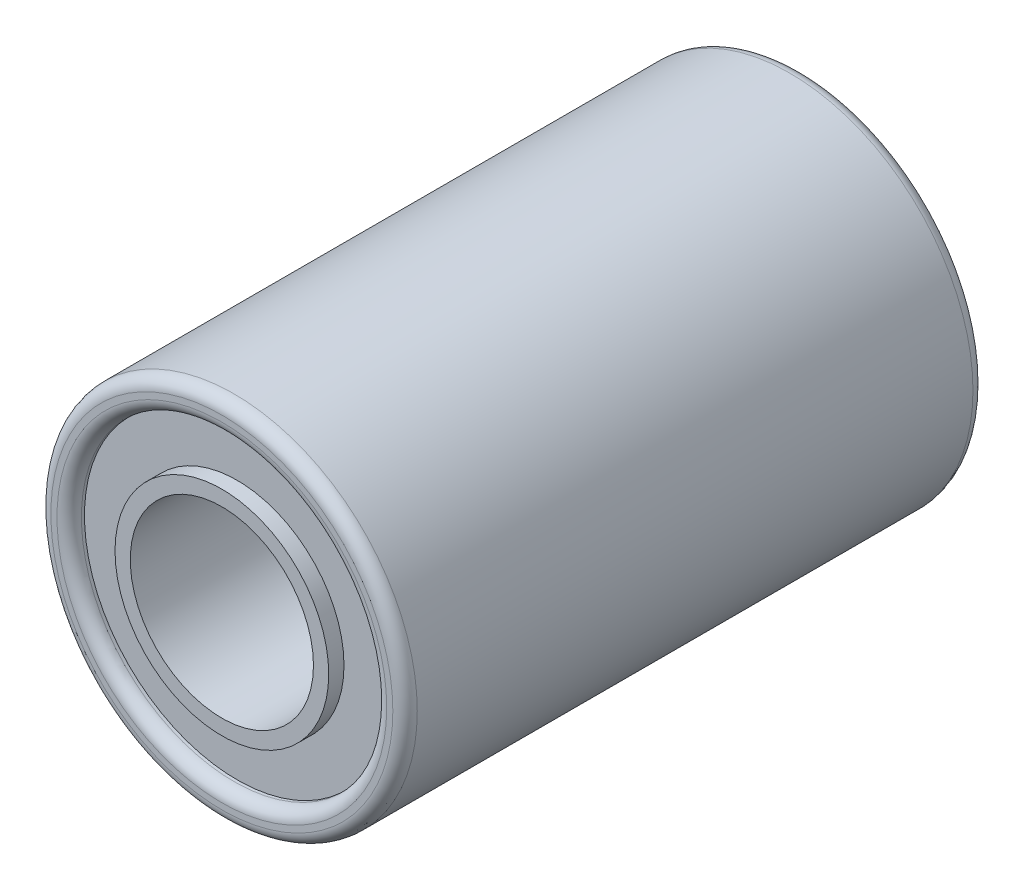
ISO-10303-21;
HEADER;
FILE_DESCRIPTION(('STEP AP214'),'2;1');
FILE_NAME('part.step','',(''),(''),'','','');
FILE_SCHEMA(('AUTOMOTIVE_DESIGN { 1 0 10303 214 1 1 1 1 }'));
ENDSEC;
DATA;
#1=APPLICATION_CONTEXT('core data for automotive mechanical design processes');
#2=APPLICATION_PROTOCOL_DEFINITION('international standard','automotive_design',2000,#1);
#3=PRODUCT_CONTEXT('',#1,'mechanical');
#4=PRODUCT('Part','Part','',(#3));
#5=PRODUCT_RELATED_PRODUCT_CATEGORY('part','',(#4));
#6=PRODUCT_DEFINITION_FORMATION('','',#4);
#7=PRODUCT_DEFINITION_CONTEXT('part definition',#1,'design');
#8=PRODUCT_DEFINITION('design','',#6,#7);
#9=PRODUCT_DEFINITION_SHAPE('','',#8);
#10=(LENGTH_UNIT() NAMED_UNIT(*) SI_UNIT(.MILLI.,.METRE.));
#11=(NAMED_UNIT(*) PLANE_ANGLE_UNIT() SI_UNIT($,.RADIAN.));
#12=(NAMED_UNIT(*) SI_UNIT($,.STERADIAN.) SOLID_ANGLE_UNIT());
#13=UNCERTAINTY_MEASURE_WITH_UNIT(LENGTH_MEASURE(1.E-05),#10,'distance_accuracy_value','');
#14=(GEOMETRIC_REPRESENTATION_CONTEXT(3) GLOBAL_UNCERTAINTY_ASSIGNED_CONTEXT((#13)) GLOBAL_UNIT_ASSIGNED_CONTEXT((#10,
#11,#12)) REPRESENTATION_CONTEXT('',''));
#15=CARTESIAN_POINT('',(0.,0.,0.));
#16=DIRECTION('',(0.,0.,1.));
#17=DIRECTION('',(1.,0.,0.));
#18=AXIS2_PLACEMENT_3D('',#15,#16,#17);
#19=CARTESIAN_POINT('',(0.,0.,0.));
#20=DIRECTION('',(0.,0.,1.));
#21=DIRECTION('',(1.,0.,0.));
#22=AXIS2_PLACEMENT_3D('',#19,#20,#21);
#23=PLANE('',#22);
#24=CARTESIAN_POINT('',(0.,0.,0.));
#25=DIRECTION('',(0.,0.,1.));
#26=DIRECTION('',(1.,0.,0.));
#27=AXIS2_PLACEMENT_3D('',#24,#25,#26);
#28=CIRCLE('',#27,3.);
#29=CARTESIAN_POINT('',(3.,0.,0.));
#30=VERTEX_POINT('',#29);
#31=EDGE_CURVE('E69',#30,#30,#28,.T.);
#32=ORIENTED_EDGE('',*,*,#31,.T.);
#33=EDGE_LOOP('',(#32));
#34=FACE_BOUND('',#33,.T.);
#35=CARTESIAN_POINT('',(0.,0.,0.));
#36=DIRECTION('',(0.,0.,-1.));
#37=DIRECTION('',(-1.,0.,0.));
#38=AXIS2_PLACEMENT_3D('',#35,#36,#37);
#39=CIRCLE('',#38,3.5);
#40=CARTESIAN_POINT('',(-3.5,0.,0.));
#41=VERTEX_POINT('',#40);
#42=EDGE_CURVE('E87',#41,#41,#39,.T.);
#43=ORIENTED_EDGE('',*,*,#42,.T.);
#44=EDGE_LOOP('',(#43));
#45=FACE_BOUND('',#44,.T.);
#46=ADVANCED_FACE('F36',(#34,#45),#23,.F.);
#47=CARTESIAN_POINT('',(0.,0.,19.));
#48=DIRECTION('',(0.,0.,1.));
#49=DIRECTION('',(1.,0.,0.));
#50=AXIS2_PLACEMENT_3D('',#47,#48,#49);
#51=PLANE('',#50);
#52=CARTESIAN_POINT('',(0.,0.,19.));
#53=DIRECTION('',(0.,0.,1.));
#54=DIRECTION('',(1.,0.,0.));
#55=AXIS2_PLACEMENT_3D('',#52,#53,#54);
#56=CIRCLE('',#55,3.);
#57=CARTESIAN_POINT('',(3.,0.,19.));
#58=VERTEX_POINT('',#57);
#59=EDGE_CURVE('E68',#58,#58,#56,.T.);
#60=ORIENTED_EDGE('',*,*,#59,.F.);
#61=EDGE_LOOP('',(#60));
#62=FACE_BOUND('',#61,.T.);
#63=CARTESIAN_POINT('',(0.,0.,19.));
#64=DIRECTION('',(0.,0.,1.));
#65=DIRECTION('',(1.,0.,0.));
#66=AXIS2_PLACEMENT_3D('',#63,#64,#65);
#67=CIRCLE('',#66,3.5);
#68=CARTESIAN_POINT('',(3.5,0.,19.));
#69=VERTEX_POINT('',#68);
#70=EDGE_CURVE('E78',#69,#69,#67,.T.);
#71=ORIENTED_EDGE('',*,*,#70,.T.);
#72=EDGE_LOOP('',(#71));
#73=FACE_BOUND('',#72,.T.);
#74=ADVANCED_FACE('F114',(#62,#73),#51,.T.);
#75=CARTESIAN_POINT('',(0.,0.,19.));
#76=DIRECTION('',(0.,0.,1.));
#77=DIRECTION('',(1.,0.,0.));
#78=AXIS2_PLACEMENT_3D('',#75,#76,#77);
#79=CIRCLE('',#78,5.4);
#80=CARTESIAN_POINT('',(5.4,0.,19.));
#81=VERTEX_POINT('',#80);
#82=EDGE_CURVE('E10',#81,#81,#79,.F.);
#83=ORIENTED_EDGE('',*,*,#82,.T.);
#84=EDGE_LOOP('',(#83));
#85=FACE_BOUND('',#84,.T.);
#86=CARTESIAN_POINT('',(0.,0.,19.));
#87=DIRECTION('',(0.,0.,1.));
#88=DIRECTION('',(1.,0.,0.));
#89=AXIS2_PLACEMENT_3D('',#86,#87,#88);
#90=CIRCLE('',#89,5.6);
#91=CARTESIAN_POINT('',(5.6,0.,19.));
#92=VERTEX_POINT('',#91);
#93=EDGE_CURVE('E43',#92,#92,#90,.T.);
#94=ORIENTED_EDGE('',*,*,#93,.T.);
#95=EDGE_LOOP('',(#94));
#96=FACE_BOUND('',#95,.T.);
#97=ADVANCED_FACE('F121',(#85,#96),#51,.T.);
#98=CARTESIAN_POINT('',(0.,0.,0.));
#99=DIRECTION('',(0.,0.,1.));
#100=DIRECTION('',(1.,0.,0.));
#101=AXIS2_PLACEMENT_3D('',#98,#99,#100);
#102=CIRCLE('',#101,5.4);
#103=CARTESIAN_POINT('',(5.4,0.,0.));
#104=VERTEX_POINT('',#103);
#105=EDGE_CURVE('E59',#104,#104,#102,.T.);
#106=ORIENTED_EDGE('',*,*,#105,.T.);
#107=EDGE_LOOP('',(#106));
#108=FACE_BOUND('',#107,.T.);
#109=CARTESIAN_POINT('',(0.,0.,0.));
#110=DIRECTION('',(0.,0.,1.));
#111=DIRECTION('',(1.,0.,0.));
#112=AXIS2_PLACEMENT_3D('',#109,#110,#111);
#113=CIRCLE('',#112,5.6);
#114=CARTESIAN_POINT('',(5.6,0.,0.));
#115=VERTEX_POINT('',#114);
#116=EDGE_CURVE('E62',#115,#115,#113,.F.);
#117=ORIENTED_EDGE('',*,*,#116,.T.);
#118=EDGE_LOOP('',(#117));
#119=FACE_BOUND('',#118,.T.);
#120=ADVANCED_FACE('F117',(#108,#119),#23,.F.);
#121=CARTESIAN_POINT('',(0.,0.,19.));
#122=DIRECTION('',(0.,0.,-1.));
#123=DIRECTION('',(-1.,0.,0.));
#124=AXIS2_PLACEMENT_3D('',#121,#122,#123);
#125=CYLINDRICAL_SURFACE('',#124,6.);
#126=CARTESIAN_POINT('',(0.,0.,0.400000000000001));
#127=DIRECTION('',(0.,0.,1.));
#128=DIRECTION('',(1.,0.,0.));
#129=AXIS2_PLACEMENT_3D('',#126,#127,#128);
#130=CIRCLE('',#129,6.);
#131=CARTESIAN_POINT('',(6.,0.,0.400000000000001));
#132=VERTEX_POINT('',#131);
#133=EDGE_CURVE('E51',#132,#132,#130,.T.);
#134=ORIENTED_EDGE('',*,*,#133,.T.);
#135=EDGE_LOOP('',(#134));
#136=FACE_BOUND('',#135,.T.);
#137=CARTESIAN_POINT('',(0.,0.,18.6));
#138=DIRECTION('',(0.,0.,1.));
#139=DIRECTION('',(1.,0.,0.));
#140=AXIS2_PLACEMENT_3D('',#137,#138,#139);
#141=CIRCLE('',#140,6.);
#142=CARTESIAN_POINT('',(6.,0.,18.6));
#143=VERTEX_POINT('',#142);
#144=EDGE_CURVE('E56',#143,#143,#141,.F.);
#145=ORIENTED_EDGE('',*,*,#144,.T.);
#146=EDGE_LOOP('',(#145));
#147=FACE_BOUND('',#146,.T.);
#148=ADVANCED_FACE('F127',(#136,#147),#125,.T.);
#149=CARTESIAN_POINT('',(0.,0.,19.));
#150=DIRECTION('',(0.,0.,-1.));
#151=DIRECTION('',(-1.,0.,0.));
#152=AXIS2_PLACEMENT_3D('',#149,#150,#151);
#153=CYLINDRICAL_SURFACE('',#152,3.);
#154=ORIENTED_EDGE('',*,*,#59,.T.);
#155=EDGE_LOOP('',(#154));
#156=FACE_BOUND('',#155,.T.);
#157=ORIENTED_EDGE('',*,*,#31,.F.);
#158=EDGE_LOOP('',(#157));
#159=FACE_BOUND('',#158,.T.);
#160=ADVANCED_FACE('F133',(#156,#159),#153,.F.);
#161=CARTESIAN_POINT('',(0.,0.,18.5));
#162=DIRECTION('',(0.,0.,1.));
#163=DIRECTION('',(1.,0.,0.));
#164=AXIS2_PLACEMENT_3D('',#161,#162,#163);
#165=CYLINDRICAL_SURFACE('',#164,5.);
#166=CARTESIAN_POINT('',(0.,0.,18.6));
#167=DIRECTION('',(0.,0.,1.));
#168=DIRECTION('',(1.,0.,0.));
#169=AXIS2_PLACEMENT_3D('',#166,#167,#168);
#170=CIRCLE('',#169,5.);
#171=CARTESIAN_POINT('',(5.,0.,18.6));
#172=VERTEX_POINT('',#171);
#173=EDGE_CURVE('E47',#172,#172,#170,.T.);
#174=ORIENTED_EDGE('',*,*,#173,.T.);
#175=EDGE_LOOP('',(#174));
#176=FACE_BOUND('',#175,.T.);
#177=CARTESIAN_POINT('',(0.,0.,18.5));
#178=DIRECTION('',(0.,0.,1.));
#179=DIRECTION('',(1.,0.,0.));
#180=AXIS2_PLACEMENT_3D('',#177,#178,#179);
#181=CIRCLE('',#180,5.);
#182=CARTESIAN_POINT('',(5.,0.,18.5));
#183=VERTEX_POINT('',#182);
#184=EDGE_CURVE('E72',#183,#183,#181,.T.);
#185=ORIENTED_EDGE('',*,*,#184,.F.);
#186=EDGE_LOOP('',(#185));
#187=FACE_BOUND('',#186,.T.);
#188=ADVANCED_FACE('F182',(#176,#187),#165,.F.);
#189=CARTESIAN_POINT('',(0.,0.,18.5));
#190=DIRECTION('',(0.,0.,1.));
#191=DIRECTION('',(1.,0.,0.));
#192=AXIS2_PLACEMENT_3D('',#189,#190,#191);
#193=PLANE('',#192);
#194=CARTESIAN_POINT('',(0.,0.,18.5));
#195=DIRECTION('',(0.,0.,1.));
#196=DIRECTION('',(1.,0.,0.));
#197=AXIS2_PLACEMENT_3D('',#194,#195,#196);
#198=CIRCLE('',#197,3.5);
#199=CARTESIAN_POINT('',(3.5,0.,18.5));
#200=VERTEX_POINT('',#199);
#201=EDGE_CURVE('E77',#200,#200,#198,.T.);
#202=ORIENTED_EDGE('',*,*,#201,.F.);
#203=EDGE_LOOP('',(#202));
#204=FACE_BOUND('',#203,.T.);
#205=ORIENTED_EDGE('',*,*,#184,.T.);
#206=EDGE_LOOP('',(#205));
#207=FACE_BOUND('',#206,.T.);
#208=ADVANCED_FACE('F110',(#204,#207),#193,.T.);
#209=CARTESIAN_POINT('',(0.,0.,18.5));
#210=DIRECTION('',(0.,0.,1.));
#211=DIRECTION('',(1.,0.,0.));
#212=AXIS2_PLACEMENT_3D('',#209,#210,#211);
#213=CYLINDRICAL_SURFACE('',#212,3.5);
#214=ORIENTED_EDGE('',*,*,#201,.T.);
#215=EDGE_LOOP('',(#214));
#216=FACE_BOUND('',#215,.T.);
#217=ORIENTED_EDGE('',*,*,#70,.F.);
#218=EDGE_LOOP('',(#217));
#219=FACE_BOUND('',#218,.T.);
#220=ADVANCED_FACE('F104',(#216,#219),#213,.T.);
#221=CARTESIAN_POINT('',(0.,0.,0.5));
#222=DIRECTION('',(0.,0.,-1.));
#223=DIRECTION('',(-1.,0.,0.));
#224=AXIS2_PLACEMENT_3D('',#221,#222,#223);
#225=CYLINDRICAL_SURFACE('',#224,5.);
#226=CARTESIAN_POINT('',(0.,0.,0.4));
#227=DIRECTION('',(0.,0.,1.));
#228=DIRECTION('',(1.,0.,0.));
#229=AXIS2_PLACEMENT_3D('',#226,#227,#228);
#230=CIRCLE('',#229,5.);
#231=CARTESIAN_POINT('',(5.,0.,0.4));
#232=VERTEX_POINT('',#231);
#233=EDGE_CURVE('E65',#232,#232,#230,.F.);
#234=ORIENTED_EDGE('',*,*,#233,.T.);
#235=EDGE_LOOP('',(#234));
#236=FACE_BOUND('',#235,.T.);
#237=CARTESIAN_POINT('',(0.,0.,0.5));
#238=DIRECTION('',(0.,0.,-1.));
#239=DIRECTION('',(-1.,0.,0.));
#240=AXIS2_PLACEMENT_3D('',#237,#238,#239);
#241=CIRCLE('',#240,5.);
#242=CARTESIAN_POINT('',(-5.,0.,0.5));
#243=VERTEX_POINT('',#242);
#244=EDGE_CURVE('E81',#243,#243,#241,.T.);
#245=ORIENTED_EDGE('',*,*,#244,.F.);
#246=EDGE_LOOP('',(#245));
#247=FACE_BOUND('',#246,.T.);
#248=ADVANCED_FACE('F99',(#236,#247),#225,.F.);
#249=CARTESIAN_POINT('',(0.,0.,0.5));
#250=DIRECTION('',(0.,0.,-1.));
#251=DIRECTION('',(-1.,0.,0.));
#252=AXIS2_PLACEMENT_3D('',#249,#250,#251);
#253=PLANE('',#252);
#254=CARTESIAN_POINT('',(0.,0.,0.5));
#255=DIRECTION('',(0.,0.,-1.));
#256=DIRECTION('',(-1.,0.,0.));
#257=AXIS2_PLACEMENT_3D('',#254,#255,#256);
#258=CIRCLE('',#257,3.5);
#259=CARTESIAN_POINT('',(-3.5,0.,0.5));
#260=VERTEX_POINT('',#259);
#261=EDGE_CURVE('E86',#260,#260,#258,.T.);
#262=ORIENTED_EDGE('',*,*,#261,.F.);
#263=EDGE_LOOP('',(#262));
#264=FACE_BOUND('',#263,.T.);
#265=ORIENTED_EDGE('',*,*,#244,.T.);
#266=EDGE_LOOP('',(#265));
#267=FACE_BOUND('',#266,.T.);
#268=ADVANCED_FACE('F96',(#264,#267),#253,.T.);
#269=CARTESIAN_POINT('',(0.,0.,0.5));
#270=DIRECTION('',(0.,0.,-1.));
#271=DIRECTION('',(-1.,0.,0.));
#272=AXIS2_PLACEMENT_3D('',#269,#270,#271);
#273=CYLINDRICAL_SURFACE('',#272,3.5);
#274=ORIENTED_EDGE('',*,*,#261,.T.);
#275=EDGE_LOOP('',(#274));
#276=FACE_BOUND('',#275,.T.);
#277=ORIENTED_EDGE('',*,*,#42,.F.);
#278=EDGE_LOOP('',(#277));
#279=FACE_BOUND('',#278,.T.);
#280=ADVANCED_FACE('F93',(#276,#279),#273,.T.);
#281=CARTESIAN_POINT('',(0.,0.,0.4));
#282=DIRECTION('',(0.,0.,1.));
#283=DIRECTION('',(1.,0.,0.));
#284=AXIS2_PLACEMENT_3D('',#281,#282,#283);
#285=TOROIDAL_SURFACE('',#284,5.4,0.4);
#286=ORIENTED_EDGE('',*,*,#105,.F.);
#287=EDGE_LOOP('',(#286));
#288=FACE_BOUND('',#287,.T.);
#289=ORIENTED_EDGE('',*,*,#233,.F.);
#290=EDGE_LOOP('',(#289));
#291=FACE_BOUND('',#290,.T.);
#292=ADVANCED_FACE('F143',(#288,#291),#285,.T.);
#293=CARTESIAN_POINT('',(0.,0.,0.400000000000001));
#294=DIRECTION('',(0.,0.,1.));
#295=DIRECTION('',(1.,0.,0.));
#296=AXIS2_PLACEMENT_3D('',#293,#294,#295);
#297=TOROIDAL_SURFACE('',#296,5.6,0.4);
#298=ORIENTED_EDGE('',*,*,#116,.F.);
#299=EDGE_LOOP('',(#298));
#300=FACE_BOUND('',#299,.T.);
#301=ORIENTED_EDGE('',*,*,#133,.F.);
#302=EDGE_LOOP('',(#301));
#303=FACE_BOUND('',#302,.T.);
#304=ADVANCED_FACE('F139',(#300,#303),#297,.T.);
#305=CARTESIAN_POINT('',(0.,0.,18.6));
#306=DIRECTION('',(0.,0.,1.));
#307=DIRECTION('',(1.,0.,0.));
#308=AXIS2_PLACEMENT_3D('',#305,#306,#307);
#309=TOROIDAL_SURFACE('',#308,5.4,0.4);
#310=ORIENTED_EDGE('',*,*,#82,.F.);
#311=EDGE_LOOP('',(#310));
#312=FACE_BOUND('',#311,.T.);
#313=ORIENTED_EDGE('',*,*,#173,.F.);
#314=EDGE_LOOP('',(#313));
#315=FACE_BOUND('',#314,.T.);
#316=ADVANCED_FACE('F142',(#312,#315),#309,.T.);
#317=CARTESIAN_POINT('',(0.,0.,18.6));
#318=DIRECTION('',(0.,0.,1.));
#319=DIRECTION('',(1.,0.,0.));
#320=AXIS2_PLACEMENT_3D('',#317,#318,#319);
#321=TOROIDAL_SURFACE('',#320,5.6,0.4);
#322=ORIENTED_EDGE('',*,*,#144,.F.);
#323=EDGE_LOOP('',(#322));
#324=FACE_BOUND('',#323,.T.);
#325=ORIENTED_EDGE('',*,*,#93,.F.);
#326=EDGE_LOOP('',(#325));
#327=FACE_BOUND('',#326,.T.);
#328=ADVANCED_FACE('F38',(#324,#327),#321,.T.);
#329=CLOSED_SHELL('',(#46,#74,#97,#120,#148,#160,#188,#208,#220,#248,#268,#280,#292,#304,#316,#328));
#330=MANIFOLD_SOLID_BREP('B2',#329);
#331=ADVANCED_BREP_SHAPE_REPRESENTATION('',(#18,#330),#14);
#332=SHAPE_DEFINITION_REPRESENTATION(#9,#331);
ENDSEC;
END-ISO-10303-21;
